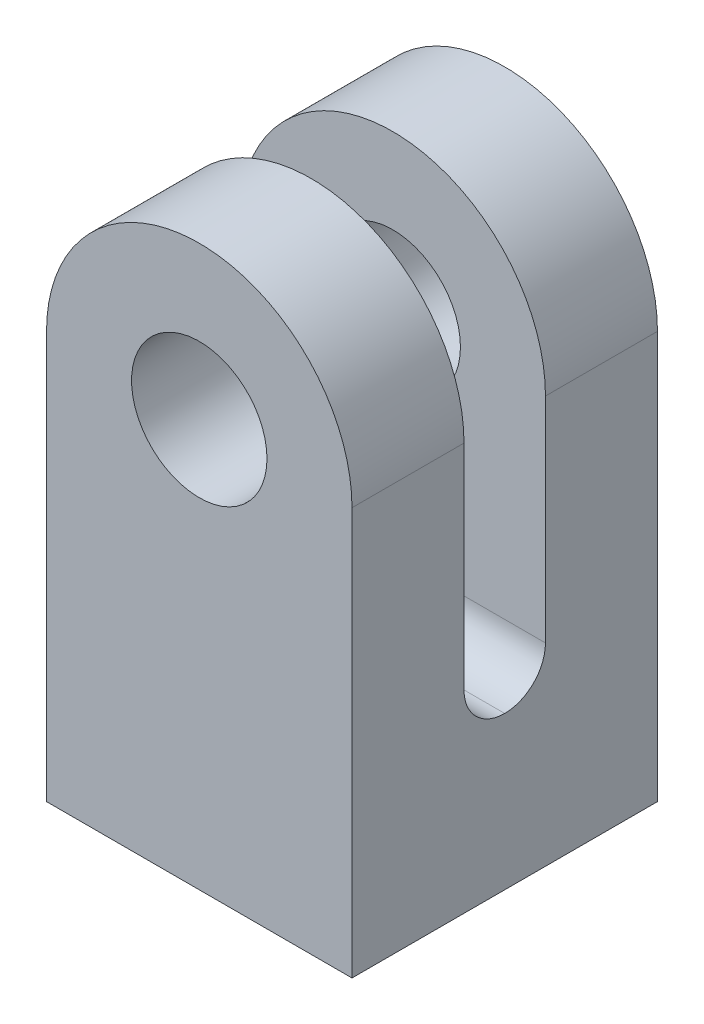
ISO-10303-21;
HEADER;
FILE_DESCRIPTION(('STEP AP214'),'2;1');
FILE_NAME('part.step','',(''),(''),'','','');
FILE_SCHEMA(('AUTOMOTIVE_DESIGN { 1 0 10303 214 1 1 1 1 }'));
ENDSEC;
DATA;
#1=APPLICATION_CONTEXT('core data for automotive mechanical design processes');
#2=APPLICATION_PROTOCOL_DEFINITION('international standard','automotive_design',2000,#1);
#3=PRODUCT_CONTEXT('',#1,'mechanical');
#4=PRODUCT('Part','Part','',(#3));
#5=PRODUCT_RELATED_PRODUCT_CATEGORY('part','',(#4));
#6=PRODUCT_DEFINITION_FORMATION('','',#4);
#7=PRODUCT_DEFINITION_CONTEXT('part definition',#1,'design');
#8=PRODUCT_DEFINITION('design','',#6,#7);
#9=PRODUCT_DEFINITION_SHAPE('','',#8);
#10=(LENGTH_UNIT() NAMED_UNIT(*) SI_UNIT(.MILLI.,.METRE.));
#11=(NAMED_UNIT(*) PLANE_ANGLE_UNIT() SI_UNIT($,.RADIAN.));
#12=(NAMED_UNIT(*) SI_UNIT($,.STERADIAN.) SOLID_ANGLE_UNIT());
#13=UNCERTAINTY_MEASURE_WITH_UNIT(LENGTH_MEASURE(1.E-05),#10,'distance_accuracy_value','');
#14=(GEOMETRIC_REPRESENTATION_CONTEXT(3) GLOBAL_UNCERTAINTY_ASSIGNED_CONTEXT((#13)) GLOBAL_UNIT_ASSIGNED_CONTEXT((#10,
#11,#12)) REPRESENTATION_CONTEXT('',''));
#15=CARTESIAN_POINT('',(0.,0.,0.));
#16=DIRECTION('',(0.,0.,1.));
#17=DIRECTION('',(1.,0.,0.));
#18=AXIS2_PLACEMENT_3D('',#15,#16,#17);
#19=CARTESIAN_POINT('',(30.,0.,30.));
#20=DIRECTION('',(-1.,0.,0.));
#21=DIRECTION('',(0.,-1.,0.));
#22=AXIS2_PLACEMENT_3D('',#19,#20,#21);
#23=PLANE('',#22);
#24=DIRECTION('',(0.,1.,0.));
#25=VECTOR('',#24,1.);
#26=CARTESIAN_POINT('',(30.,15.,11.));
#27=LINE('',#26,#25);
#28=CARTESIAN_POINT('',(30.,19.,11.));
#29=VERTEX_POINT('',#28);
#30=CARTESIAN_POINT('',(30.,40.,11.));
#31=VERTEX_POINT('',#30);
#32=EDGE_CURVE('E122',#29,#31,#27,.T.);
#33=ORIENTED_EDGE('',*,*,#32,.F.);
#34=CARTESIAN_POINT('',(30.,19.,15.));
#35=DIRECTION('',(-1.,0.,0.));
#36=DIRECTION('',(0.,-1.,0.));
#37=AXIS2_PLACEMENT_3D('',#34,#35,#36);
#38=CIRCLE('',#37,4.);
#39=CARTESIAN_POINT('',(30.,15.,15.));
#40=VERTEX_POINT('',#39);
#41=EDGE_CURVE('E11',#29,#40,#38,.T.);
#42=ORIENTED_EDGE('',*,*,#41,.T.);
#43=CARTESIAN_POINT('',(30.,19.,15.));
#44=DIRECTION('',(-1.,0.,0.));
#45=DIRECTION('',(0.,-1.,0.));
#46=AXIS2_PLACEMENT_3D('',#43,#44,#45);
#47=CIRCLE('',#46,4.);
#48=CARTESIAN_POINT('',(30.,19.,19.));
#49=VERTEX_POINT('',#48);
#50=EDGE_CURVE('E116',#40,#49,#47,.T.);
#51=ORIENTED_EDGE('',*,*,#50,.T.);
#52=DIRECTION('',(0.,1.,0.));
#53=VECTOR('',#52,1.);
#54=CARTESIAN_POINT('',(30.,15.,19.));
#55=LINE('',#54,#53);
#56=CARTESIAN_POINT('',(30.,40.,19.));
#57=VERTEX_POINT('',#56);
#58=EDGE_CURVE('E107',#49,#57,#55,.T.);
#59=ORIENTED_EDGE('',*,*,#58,.T.);
#60=DIRECTION('',(0.,0.,-1.));
#61=VECTOR('',#60,1.);
#62=CARTESIAN_POINT('',(30.,40.,30.));
#63=LINE('',#62,#61);
#64=CARTESIAN_POINT('',(30.,40.,30.));
#65=VERTEX_POINT('',#64);
#66=EDGE_CURVE('E113',#65,#57,#63,.T.);
#67=ORIENTED_EDGE('',*,*,#66,.F.);
#68=DIRECTION('',(0.,1.,0.));
#69=VECTOR('',#68,1.);
#70=CARTESIAN_POINT('',(30.,0.,30.));
#71=LINE('',#70,#69);
#72=CARTESIAN_POINT('',(30.,0.,30.));
#73=VERTEX_POINT('',#72);
#74=EDGE_CURVE('E186',#73,#65,#71,.T.);
#75=ORIENTED_EDGE('',*,*,#74,.F.);
#76=DIRECTION('',(0.,0.,-1.));
#77=VECTOR('',#76,1.);
#78=CARTESIAN_POINT('',(30.,0.,30.));
#79=LINE('',#78,#77);
#80=CARTESIAN_POINT('',(30.,0.,0.));
#81=VERTEX_POINT('',#80);
#82=EDGE_CURVE('E131',#73,#81,#79,.T.);
#83=ORIENTED_EDGE('',*,*,#82,.T.);
#84=DIRECTION('',(0.,1.,0.));
#85=VECTOR('',#84,1.);
#86=CARTESIAN_POINT('',(30.,0.,0.));
#87=LINE('',#86,#85);
#88=CARTESIAN_POINT('',(30.,40.,0.));
#89=VERTEX_POINT('',#88);
#90=EDGE_CURVE('E199',#81,#89,#87,.T.);
#91=ORIENTED_EDGE('',*,*,#90,.T.);
#92=EDGE_CURVE('E133',#31,#89,#63,.T.);
#93=ORIENTED_EDGE('',*,*,#92,.F.);
#94=EDGE_LOOP('',(#33,#42,#51,#59,#67,#75,#83,#91,#93));
#95=FACE_BOUND('',#94,.T.);
#96=ADVANCED_FACE('F39',(#95),#23,.F.);
#97=CARTESIAN_POINT('',(15.,40.,30.));
#98=DIRECTION('',(0.,0.,-1.));
#99=DIRECTION('',(-1.,0.,0.));
#100=AXIS2_PLACEMENT_3D('',#97,#98,#99);
#101=CYLINDRICAL_SURFACE('',#100,15.);
#102=CARTESIAN_POINT('',(15.,40.,11.));
#103=DIRECTION('',(0.,0.,1.));
#104=DIRECTION('',(1.,0.,0.));
#105=AXIS2_PLACEMENT_3D('',#102,#103,#104);
#106=CIRCLE('',#105,15.);
#107=CARTESIAN_POINT('',(0.,40.,11.));
#108=VERTEX_POINT('',#107);
#109=EDGE_CURVE('E152',#31,#108,#106,.T.);
#110=ORIENTED_EDGE('',*,*,#109,.F.);
#111=ORIENTED_EDGE('',*,*,#92,.T.);
#112=CARTESIAN_POINT('',(15.,40.,0.));
#113=DIRECTION('',(0.,0.,1.));
#114=DIRECTION('',(1.,0.,0.));
#115=AXIS2_PLACEMENT_3D('',#112,#113,#114);
#116=CIRCLE('',#115,15.);
#117=CARTESIAN_POINT('',(0.,40.,0.));
#118=VERTEX_POINT('',#117);
#119=EDGE_CURVE('E190',#89,#118,#116,.T.);
#120=ORIENTED_EDGE('',*,*,#119,.T.);
#121=DIRECTION('',(0.,0.,-1.));
#122=VECTOR('',#121,1.);
#123=CARTESIAN_POINT('',(0.,40.,30.));
#124=LINE('',#123,#122);
#125=EDGE_CURVE('E195',#108,#118,#124,.T.);
#126=ORIENTED_EDGE('',*,*,#125,.F.);
#127=EDGE_LOOP('',(#110,#111,#120,#126));
#128=FACE_BOUND('',#127,.T.);
#129=ADVANCED_FACE('F202',(#128),#101,.T.);
#130=CARTESIAN_POINT('',(15.,40.,30.));
#131=DIRECTION('',(0.,0.,-1.));
#132=DIRECTION('',(-1.,0.,0.));
#133=AXIS2_PLACEMENT_3D('',#130,#131,#132);
#134=CYLINDRICAL_SURFACE('',#133,6.65);
#135=CARTESIAN_POINT('',(15.,40.,0.));
#136=DIRECTION('',(0.,0.,1.));
#137=DIRECTION('',(1.,0.,0.));
#138=AXIS2_PLACEMENT_3D('',#135,#136,#137);
#139=CIRCLE('',#138,6.65);
#140=CARTESIAN_POINT('',(21.65,40.,0.));
#141=VERTEX_POINT('',#140);
#142=EDGE_CURVE('E176',#141,#141,#139,.T.);
#143=ORIENTED_EDGE('',*,*,#142,.F.);
#144=EDGE_LOOP('',(#143));
#145=FACE_BOUND('',#144,.T.);
#146=CARTESIAN_POINT('',(15.,40.,11.));
#147=DIRECTION('',(0.,0.,1.));
#148=DIRECTION('',(1.,0.,0.));
#149=AXIS2_PLACEMENT_3D('',#146,#147,#148);
#150=CIRCLE('',#149,6.65);
#151=CARTESIAN_POINT('',(21.65,40.,11.));
#152=VERTEX_POINT('',#151);
#153=EDGE_CURVE('E128',#152,#152,#150,.T.);
#154=ORIENTED_EDGE('',*,*,#153,.T.);
#155=EDGE_LOOP('',(#154));
#156=FACE_BOUND('',#155,.T.);
#157=ADVANCED_FACE('F219',(#145,#156),#134,.F.);
#158=CARTESIAN_POINT('',(15.,40.,30.));
#159=DIRECTION('',(0.,0.,1.));
#160=DIRECTION('',(1.,0.,0.));
#161=AXIS2_PLACEMENT_3D('',#158,#159,#160);
#162=PLANE('',#161);
#163=DIRECTION('',(0.,-1.,0.));
#164=VECTOR('',#163,1.);
#165=CARTESIAN_POINT('',(0.,0.,30.));
#166=LINE('',#165,#164);
#167=CARTESIAN_POINT('',(0.,40.,30.));
#168=VERTEX_POINT('',#167);
#169=CARTESIAN_POINT('',(0.,0.,30.));
#170=VERTEX_POINT('',#169);
#171=EDGE_CURVE('E182',#168,#170,#166,.T.);
#172=ORIENTED_EDGE('',*,*,#171,.T.);
#173=DIRECTION('',(1.,0.,0.));
#174=VECTOR('',#173,1.);
#175=CARTESIAN_POINT('',(0.,0.,30.));
#176=LINE('',#175,#174);
#177=EDGE_CURVE('E187',#170,#73,#176,.T.);
#178=ORIENTED_EDGE('',*,*,#177,.T.);
#179=ORIENTED_EDGE('',*,*,#74,.T.);
#180=CARTESIAN_POINT('',(15.,40.,30.));
#181=DIRECTION('',(0.,0.,1.));
#182=DIRECTION('',(1.,0.,0.));
#183=AXIS2_PLACEMENT_3D('',#180,#181,#182);
#184=CIRCLE('',#183,15.);
#185=EDGE_CURVE('E135',#65,#168,#184,.T.);
#186=ORIENTED_EDGE('',*,*,#185,.T.);
#187=EDGE_LOOP('',(#172,#178,#179,#186));
#188=FACE_BOUND('',#187,.T.);
#189=CARTESIAN_POINT('',(15.,40.,30.));
#190=DIRECTION('',(0.,0.,1.));
#191=DIRECTION('',(1.,0.,0.));
#192=AXIS2_PLACEMENT_3D('',#189,#190,#191);
#193=CIRCLE('',#192,6.65);
#194=CARTESIAN_POINT('',(21.65,40.,30.));
#195=VERTEX_POINT('',#194);
#196=EDGE_CURVE('E180',#195,#195,#193,.T.);
#197=ORIENTED_EDGE('',*,*,#196,.F.);
#198=EDGE_LOOP('',(#197));
#199=FACE_BOUND('',#198,.T.);
#200=ADVANCED_FACE('F211',(#188,#199),#162,.T.);
#201=CARTESIAN_POINT('',(15.,40.,0.));
#202=DIRECTION('',(0.,0.,1.));
#203=DIRECTION('',(1.,0.,0.));
#204=AXIS2_PLACEMENT_3D('',#201,#202,#203);
#205=PLANE('',#204);
#206=DIRECTION('',(0.,-1.,0.));
#207=VECTOR('',#206,1.);
#208=CARTESIAN_POINT('',(0.,0.,0.));
#209=LINE('',#208,#207);
#210=CARTESIAN_POINT('',(0.,0.,0.));
#211=VERTEX_POINT('',#210);
#212=EDGE_CURVE('E179',#118,#211,#209,.T.);
#213=ORIENTED_EDGE('',*,*,#212,.F.);
#214=ORIENTED_EDGE('',*,*,#119,.F.);
#215=ORIENTED_EDGE('',*,*,#90,.F.);
#216=DIRECTION('',(1.,0.,0.));
#217=VECTOR('',#216,1.);
#218=CARTESIAN_POINT('',(0.,0.,0.));
#219=LINE('',#218,#217);
#220=EDGE_CURVE('E193',#211,#81,#219,.T.);
#221=ORIENTED_EDGE('',*,*,#220,.F.);
#222=EDGE_LOOP('',(#213,#214,#215,#221));
#223=FACE_BOUND('',#222,.T.);
#224=ORIENTED_EDGE('',*,*,#142,.T.);
#225=EDGE_LOOP('',(#224));
#226=FACE_BOUND('',#225,.T.);
#227=ADVANCED_FACE('F210',(#223,#226),#205,.F.);
#228=CARTESIAN_POINT('',(0.,0.,30.));
#229=DIRECTION('',(1.,0.,0.));
#230=DIRECTION('',(0.,0.,-1.));
#231=AXIS2_PLACEMENT_3D('',#228,#229,#230);
#232=PLANE('',#231);
#233=CARTESIAN_POINT('',(0.,19.,15.));
#234=DIRECTION('',(1.,0.,0.));
#235=DIRECTION('',(0.,0.,-1.));
#236=AXIS2_PLACEMENT_3D('',#233,#234,#235);
#237=CIRCLE('',#236,4.);
#238=CARTESIAN_POINT('',(0.,19.,19.));
#239=VERTEX_POINT('',#238);
#240=CARTESIAN_POINT('',(0.,15.,15.));
#241=VERTEX_POINT('',#240);
#242=EDGE_CURVE('E62',#239,#241,#237,.T.);
#243=ORIENTED_EDGE('',*,*,#242,.T.);
#244=CARTESIAN_POINT('',(0.,19.,15.));
#245=DIRECTION('',(1.,0.,0.));
#246=DIRECTION('',(0.,0.,-1.));
#247=AXIS2_PLACEMENT_3D('',#244,#245,#246);
#248=CIRCLE('',#247,4.);
#249=CARTESIAN_POINT('',(0.,19.,11.));
#250=VERTEX_POINT('',#249);
#251=EDGE_CURVE('E48',#241,#250,#248,.T.);
#252=ORIENTED_EDGE('',*,*,#251,.T.);
#253=DIRECTION('',(0.,1.,0.));
#254=VECTOR('',#253,1.);
#255=CARTESIAN_POINT('',(0.,15.,11.));
#256=LINE('',#255,#254);
#257=EDGE_CURVE('E158',#250,#108,#256,.T.);
#258=ORIENTED_EDGE('',*,*,#257,.T.);
#259=ORIENTED_EDGE('',*,*,#125,.T.);
#260=ORIENTED_EDGE('',*,*,#212,.T.);
#261=DIRECTION('',(0.,0.,-1.));
#262=VECTOR('',#261,1.);
#263=CARTESIAN_POINT('',(0.,0.,30.));
#264=LINE('',#263,#262);
#265=EDGE_CURVE('E137',#170,#211,#264,.T.);
#266=ORIENTED_EDGE('',*,*,#265,.F.);
#267=ORIENTED_EDGE('',*,*,#171,.F.);
#268=CARTESIAN_POINT('',(0.,40.,19.));
#269=VERTEX_POINT('',#268);
#270=EDGE_CURVE('E139',#168,#269,#124,.T.);
#271=ORIENTED_EDGE('',*,*,#270,.T.);
#272=DIRECTION('',(0.,1.,0.));
#273=VECTOR('',#272,1.);
#274=CARTESIAN_POINT('',(0.,15.,19.));
#275=LINE('',#274,#273);
#276=EDGE_CURVE('E127',#239,#269,#275,.T.);
#277=ORIENTED_EDGE('',*,*,#276,.F.);
#278=EDGE_LOOP('',(#243,#252,#258,#259,#260,#266,#267,#271,#277));
#279=FACE_BOUND('',#278,.T.);
#280=ADVANCED_FACE('F157',(#279),#232,.F.);
#281=CARTESIAN_POINT('',(0.,0.,30.));
#282=DIRECTION('',(0.,1.,0.));
#283=DIRECTION('',(0.,0.,1.));
#284=AXIS2_PLACEMENT_3D('',#281,#282,#283);
#285=PLANE('',#284);
#286=ORIENTED_EDGE('',*,*,#220,.T.);
#287=ORIENTED_EDGE('',*,*,#82,.F.);
#288=ORIENTED_EDGE('',*,*,#177,.F.);
#289=ORIENTED_EDGE('',*,*,#265,.T.);
#290=EDGE_LOOP('',(#286,#287,#288,#289));
#291=FACE_BOUND('',#290,.T.);
#292=ADVANCED_FACE('F212',(#291),#285,.F.);
#293=ORIENTED_EDGE('',*,*,#66,.T.);
#294=CARTESIAN_POINT('',(15.,40.,19.));
#295=DIRECTION('',(0.,0.,1.));
#296=DIRECTION('',(1.,0.,0.));
#297=AXIS2_PLACEMENT_3D('',#294,#295,#296);
#298=CIRCLE('',#297,15.);
#299=EDGE_CURVE('E121',#57,#269,#298,.T.);
#300=ORIENTED_EDGE('',*,*,#299,.T.);
#301=ORIENTED_EDGE('',*,*,#270,.F.);
#302=ORIENTED_EDGE('',*,*,#185,.F.);
#303=EDGE_LOOP('',(#293,#300,#301,#302));
#304=FACE_BOUND('',#303,.T.);
#305=ADVANCED_FACE('F134',(#304),#101,.T.);
#306=CARTESIAN_POINT('',(15.,40.,19.));
#307=DIRECTION('',(0.,0.,1.));
#308=DIRECTION('',(1.,0.,0.));
#309=AXIS2_PLACEMENT_3D('',#306,#307,#308);
#310=CIRCLE('',#309,6.65);
#311=CARTESIAN_POINT('',(21.65,40.,19.));
#312=VERTEX_POINT('',#311);
#313=EDGE_CURVE('E119',#312,#312,#310,.T.);
#314=ORIENTED_EDGE('',*,*,#313,.F.);
#315=EDGE_LOOP('',(#314));
#316=FACE_BOUND('',#315,.T.);
#317=ORIENTED_EDGE('',*,*,#196,.T.);
#318=EDGE_LOOP('',(#317));
#319=FACE_BOUND('',#318,.T.);
#320=ADVANCED_FACE('F221',(#316,#319),#134,.F.);
#321=CARTESIAN_POINT('',(30.,15.,11.));
#322=DIRECTION('',(0.,0.,1.));
#323=DIRECTION('',(1.,0.,0.));
#324=AXIS2_PLACEMENT_3D('',#321,#322,#323);
#325=PLANE('',#324);
#326=ORIENTED_EDGE('',*,*,#153,.F.);
#327=EDGE_LOOP('',(#326));
#328=FACE_BOUND('',#327,.T.);
#329=ORIENTED_EDGE('',*,*,#257,.F.);
#330=DIRECTION('',(-1.,0.,0.));
#331=VECTOR('',#330,1.);
#332=CARTESIAN_POINT('',(30.,19.,11.));
#333=LINE('',#332,#331);
#334=EDGE_CURVE('E155',#250,#29,#333,.F.);
#335=ORIENTED_EDGE('',*,*,#334,.T.);
#336=ORIENTED_EDGE('',*,*,#32,.T.);
#337=ORIENTED_EDGE('',*,*,#109,.T.);
#338=EDGE_LOOP('',(#329,#335,#336,#337));
#339=FACE_BOUND('',#338,.T.);
#340=ADVANCED_FACE('F164',(#328,#339),#325,.T.);
#341=CARTESIAN_POINT('',(30.,15.,19.));
#342=DIRECTION('',(0.,0.,1.));
#343=DIRECTION('',(1.,0.,0.));
#344=AXIS2_PLACEMENT_3D('',#341,#342,#343);
#345=PLANE('',#344);
#346=ORIENTED_EDGE('',*,*,#313,.T.);
#347=EDGE_LOOP('',(#346));
#348=FACE_BOUND('',#347,.T.);
#349=ORIENTED_EDGE('',*,*,#58,.F.);
#350=DIRECTION('',(-1.,0.,0.));
#351=VECTOR('',#350,1.);
#352=CARTESIAN_POINT('',(0.,19.,19.));
#353=LINE('',#352,#351);
#354=EDGE_CURVE('E147',#49,#239,#353,.T.);
#355=ORIENTED_EDGE('',*,*,#354,.T.);
#356=ORIENTED_EDGE('',*,*,#276,.T.);
#357=ORIENTED_EDGE('',*,*,#299,.F.);
#358=EDGE_LOOP('',(#349,#355,#356,#357));
#359=FACE_BOUND('',#358,.T.);
#360=ADVANCED_FACE('F123',(#348,#359),#345,.F.);
#361=CARTESIAN_POINT('',(30.,19.,15.));
#362=DIRECTION('',(-1.,0.,0.));
#363=DIRECTION('',(0.,0.,1.));
#364=AXIS2_PLACEMENT_3D('',#361,#362,#363);
#365=CYLINDRICAL_SURFACE('',#364,4.);
#366=DIRECTION('',(-1.,0.,0.));
#367=VECTOR('',#366,1.);
#368=CARTESIAN_POINT('',(30.,15.,15.));
#369=LINE('',#368,#367);
#370=EDGE_CURVE('E43',#40,#241,#369,.T.);
#371=ORIENTED_EDGE('',*,*,#370,.F.);
#372=ORIENTED_EDGE('',*,*,#41,.F.);
#373=ORIENTED_EDGE('',*,*,#334,.F.);
#374=ORIENTED_EDGE('',*,*,#251,.F.);
#375=EDGE_LOOP('',(#371,#372,#373,#374));
#376=FACE_BOUND('',#375,.T.);
#377=ADVANCED_FACE('F41',(#376),#365,.F.);
#378=CARTESIAN_POINT('',(30.,19.,15.));
#379=DIRECTION('',(1.,0.,0.));
#380=DIRECTION('',(0.,0.,-1.));
#381=AXIS2_PLACEMENT_3D('',#378,#379,#380);
#382=CYLINDRICAL_SURFACE('',#381,4.);
#383=ORIENTED_EDGE('',*,*,#50,.F.);
#384=ORIENTED_EDGE('',*,*,#370,.T.);
#385=ORIENTED_EDGE('',*,*,#242,.F.);
#386=ORIENTED_EDGE('',*,*,#354,.F.);
#387=EDGE_LOOP('',(#383,#384,#385,#386));
#388=FACE_BOUND('',#387,.T.);
#389=ADVANCED_FACE('F167',(#388),#382,.F.);
#390=CLOSED_SHELL('',(#96,#129,#157,#200,#227,#280,#292,#305,#320,#340,#360,#377,#389));
#391=MANIFOLD_SOLID_BREP('B2',#390);
#392=ADVANCED_BREP_SHAPE_REPRESENTATION('',(#18,#391),#14);
#393=SHAPE_DEFINITION_REPRESENTATION(#9,#392);
ENDSEC;
END-ISO-10303-21;
